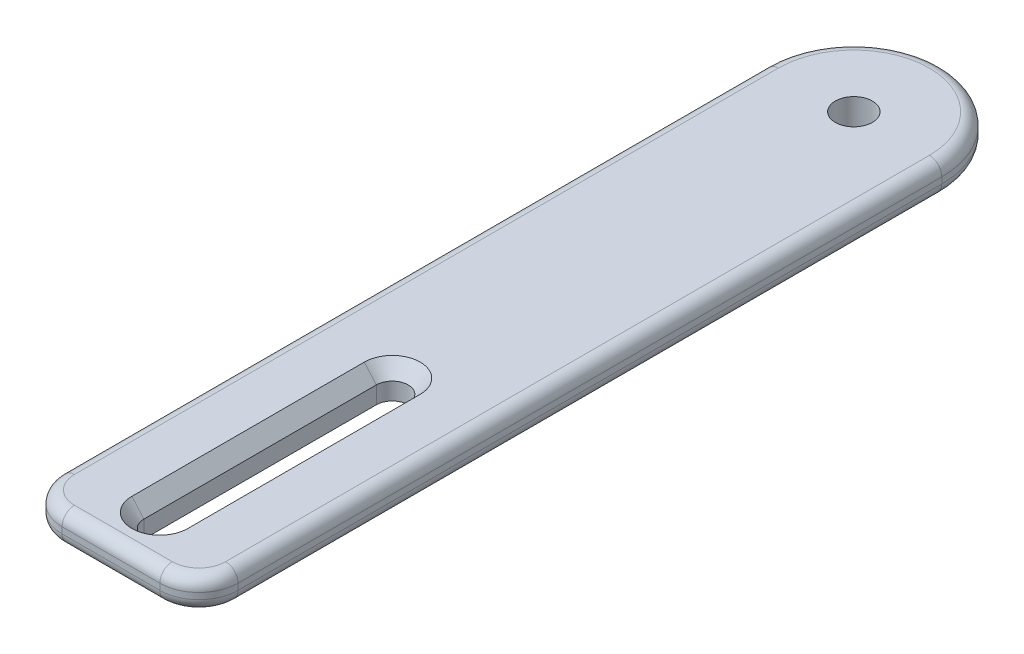
ISO-10303-21;
HEADER;
FILE_DESCRIPTION(('STEP AP214'),'2;1');
FILE_NAME('part.step','',(''),(''),'','','');
FILE_SCHEMA(('AUTOMOTIVE_DESIGN { 1 0 10303 214 1 1 1 1 }'));
ENDSEC;
DATA;
#1=APPLICATION_CONTEXT('core data for automotive mechanical design processes');
#2=APPLICATION_PROTOCOL_DEFINITION('international standard','automotive_design',2000,#1);
#3=PRODUCT_CONTEXT('',#1,'mechanical');
#4=PRODUCT('Part','Part','',(#3));
#5=PRODUCT_RELATED_PRODUCT_CATEGORY('part','',(#4));
#6=PRODUCT_DEFINITION_FORMATION('','',#4);
#7=PRODUCT_DEFINITION_CONTEXT('part definition',#1,'design');
#8=PRODUCT_DEFINITION('design','',#6,#7);
#9=PRODUCT_DEFINITION_SHAPE('','',#8);
#10=(LENGTH_UNIT() NAMED_UNIT(*) SI_UNIT(.MILLI.,.METRE.));
#11=(NAMED_UNIT(*) PLANE_ANGLE_UNIT() SI_UNIT($,.RADIAN.));
#12=(NAMED_UNIT(*) SI_UNIT($,.STERADIAN.) SOLID_ANGLE_UNIT());
#13=UNCERTAINTY_MEASURE_WITH_UNIT(LENGTH_MEASURE(1.E-05),#10,'distance_accuracy_value','');
#14=(GEOMETRIC_REPRESENTATION_CONTEXT(3) GLOBAL_UNCERTAINTY_ASSIGNED_CONTEXT((#13)) GLOBAL_UNIT_ASSIGNED_CONTEXT((#10,
#11,#12)) REPRESENTATION_CONTEXT('',''));
#15=CARTESIAN_POINT('',(0.,0.,0.));
#16=DIRECTION('',(0.,0.,1.));
#17=DIRECTION('',(1.,0.,0.));
#18=AXIS2_PLACEMENT_3D('',#15,#16,#17);
#19=CARTESIAN_POINT('',(10.63195,-3.175,0.));
#20=DIRECTION('',(-1.,0.,0.));
#21=DIRECTION('',(0.,0.,1.));
#22=AXIS2_PLACEMENT_3D('',#19,#20,#21);
#23=PLANE('',#22);
#24=DIRECTION('',(0.,1.,0.));
#25=VECTOR('',#24,1.);
#26=CARTESIAN_POINT('',(10.63195,-3.175,-5.));
#27=LINE('',#26,#25);
#28=CARTESIAN_POINT('',(10.63195,-3.175,-5.));
#29=VERTEX_POINT('',#28);
#30=CARTESIAN_POINT('',(10.63195,-1.4098340014697,-5.));
#31=VERTEX_POINT('',#30);
#32=EDGE_CURVE('E239',#29,#31,#27,.T.);
#33=ORIENTED_EDGE('',*,*,#32,.T.);
#34=DIRECTION('',(0.,0.,1.));
#35=VECTOR('',#34,1.);
#36=CARTESIAN_POINT('',(10.63195,-1.4098340014697,0.));
#37=LINE('',#36,#35);
#38=CARTESIAN_POINT('',(10.63195,-1.4098340014697,-28.78));
#39=VERTEX_POINT('',#38);
#40=EDGE_CURVE('E200',#31,#39,#37,.F.);
#41=ORIENTED_EDGE('',*,*,#40,.T.);
#42=DIRECTION('',(0.,1.,0.));
#43=VECTOR('',#42,1.);
#44=CARTESIAN_POINT('',(10.63195,-3.175,-28.78));
#45=LINE('',#44,#43);
#46=CARTESIAN_POINT('',(10.63195,-3.175,-28.78));
#47=VERTEX_POINT('',#46);
#48=EDGE_CURVE('E242',#47,#39,#45,.T.);
#49=ORIENTED_EDGE('',*,*,#48,.F.);
#50=DIRECTION('',(0.,0.,1.));
#51=VECTOR('',#50,1.);
#52=CARTESIAN_POINT('',(10.63195,-3.175,0.));
#53=LINE('',#52,#51);
#54=EDGE_CURVE('E211',#47,#29,#53,.T.);
#55=ORIENTED_EDGE('',*,*,#54,.T.);
#56=EDGE_LOOP('',(#33,#41,#49,#55));
#57=FACE_BOUND('',#56,.T.);
#58=ADVANCED_FACE('F35',(#57),#23,.T.);
#59=CARTESIAN_POINT('',(8.99999999999999,-3.175,-76.));
#60=DIRECTION('',(0.,1.,0.));
#61=DIRECTION('',(0.,0.,1.));
#62=AXIS2_PLACEMENT_3D('',#59,#60,#61);
#63=CYLINDRICAL_SURFACE('',#62,8.99999999999999);
#64=DIRECTION('',(0.,1.,0.));
#65=VECTOR('',#64,1.);
#66=CARTESIAN_POINT('',(18.,-3.175,-76.));
#67=LINE('',#66,#65);
#68=CARTESIAN_POINT('',(18.,-1.905,-76.));
#69=VERTEX_POINT('',#68);
#70=CARTESIAN_POINT('',(18.,-1.27,-76.));
#71=VERTEX_POINT('',#70);
#72=EDGE_CURVE('E217',#69,#71,#67,.T.);
#73=ORIENTED_EDGE('',*,*,#72,.F.);
#74=CARTESIAN_POINT('',(8.99999999999999,-1.905,-76.));
#75=DIRECTION('',(0.,1.,0.));
#76=DIRECTION('',(0.,0.,1.));
#77=AXIS2_PLACEMENT_3D('',#74,#75,#76);
#78=CIRCLE('',#77,8.99999999999999);
#79=CARTESIAN_POINT('',(0.,-1.905,-76.));
#80=VERTEX_POINT('',#79);
#81=EDGE_CURVE('E249',#69,#80,#78,.T.);
#82=ORIENTED_EDGE('',*,*,#81,.T.);
#83=DIRECTION('',(0.,1.,0.));
#84=VECTOR('',#83,1.);
#85=CARTESIAN_POINT('',(0.,-3.175,-76.));
#86=LINE('',#85,#84);
#87=CARTESIAN_POINT('',(0.,-1.27,-76.));
#88=VERTEX_POINT('',#87);
#89=EDGE_CURVE('E233',#80,#88,#86,.T.);
#90=ORIENTED_EDGE('',*,*,#89,.T.);
#91=CARTESIAN_POINT('',(8.99999999999999,-1.27,-76.));
#92=DIRECTION('',(0.,1.,0.));
#93=DIRECTION('',(0.,0.,1.));
#94=AXIS2_PLACEMENT_3D('',#91,#92,#93);
#95=CIRCLE('',#94,8.99999999999999);
#96=EDGE_CURVE('E220',#88,#71,#95,.F.);
#97=ORIENTED_EDGE('',*,*,#96,.T.);
#98=EDGE_LOOP('',(#73,#82,#90,#97));
#99=FACE_BOUND('',#98,.T.);
#100=ADVANCED_FACE('F385',(#99),#63,.T.);
#101=CARTESIAN_POINT('',(18.,-3.175,0.));
#102=DIRECTION('',(-1.,0.,0.));
#103=DIRECTION('',(0.,0.,1.));
#104=AXIS2_PLACEMENT_3D('',#101,#102,#103);
#105=PLANE('',#104);
#106=DIRECTION('',(0.,1.,0.));
#107=VECTOR('',#106,1.);
#108=CARTESIAN_POINT('',(18.,-3.175,-4.));
#109=LINE('',#108,#107);
#110=CARTESIAN_POINT('',(18.,-1.905,-4.));
#111=VERTEX_POINT('',#110);
#112=CARTESIAN_POINT('',(18.,-1.27,-4.));
#113=VERTEX_POINT('',#112);
#114=EDGE_CURVE('E221',#111,#113,#109,.T.);
#115=ORIENTED_EDGE('',*,*,#114,.F.);
#116=DIRECTION('',(0.,0.,1.));
#117=VECTOR('',#116,1.);
#118=CARTESIAN_POINT('',(18.,-1.905,0.));
#119=LINE('',#118,#117);
#120=EDGE_CURVE('E11',#111,#69,#119,.F.);
#121=ORIENTED_EDGE('',*,*,#120,.T.);
#122=ORIENTED_EDGE('',*,*,#72,.T.);
#123=DIRECTION('',(0.,0.,1.));
#124=VECTOR('',#123,1.);
#125=CARTESIAN_POINT('',(18.,-1.27,-4.));
#126=LINE('',#125,#124);
#127=EDGE_CURVE('E44',#71,#113,#126,.T.);
#128=ORIENTED_EDGE('',*,*,#127,.T.);
#129=EDGE_LOOP('',(#115,#121,#122,#128));
#130=FACE_BOUND('',#129,.T.);
#131=ADVANCED_FACE('F377',(#130),#105,.F.);
#132=CARTESIAN_POINT('',(14.,-3.175,-4.));
#133=DIRECTION('',(0.,1.,0.));
#134=DIRECTION('',(0.,0.,1.));
#135=AXIS2_PLACEMENT_3D('',#132,#133,#134);
#136=CYLINDRICAL_SURFACE('',#135,4.);
#137=DIRECTION('',(0.,1.,0.));
#138=VECTOR('',#137,1.);
#139=CARTESIAN_POINT('',(14.,-3.175,0.));
#140=LINE('',#139,#138);
#141=CARTESIAN_POINT('',(14.,-1.905,0.));
#142=VERTEX_POINT('',#141);
#143=CARTESIAN_POINT('',(14.,-1.27,0.));
#144=VERTEX_POINT('',#143);
#145=EDGE_CURVE('E224',#142,#144,#140,.T.);
#146=ORIENTED_EDGE('',*,*,#145,.F.);
#147=CARTESIAN_POINT('',(14.,-1.905,-4.));
#148=DIRECTION('',(0.,1.,0.));
#149=DIRECTION('',(0.,0.,1.));
#150=AXIS2_PLACEMENT_3D('',#147,#148,#149);
#151=CIRCLE('',#150,4.);
#152=EDGE_CURVE('E279',#142,#111,#151,.T.);
#153=ORIENTED_EDGE('',*,*,#152,.T.);
#154=ORIENTED_EDGE('',*,*,#114,.T.);
#155=CARTESIAN_POINT('',(14.,-1.27,-4.));
#156=DIRECTION('',(0.,1.,0.));
#157=DIRECTION('',(0.,0.,1.));
#158=AXIS2_PLACEMENT_3D('',#155,#156,#157);
#159=CIRCLE('',#158,4.);
#160=EDGE_CURVE('E277',#113,#144,#159,.F.);
#161=ORIENTED_EDGE('',*,*,#160,.T.);
#162=EDGE_LOOP('',(#146,#153,#154,#161));
#163=FACE_BOUND('',#162,.T.);
#164=ADVANCED_FACE('F374',(#163),#136,.T.);
#165=CARTESIAN_POINT('',(0.,-3.175,0.));
#166=DIRECTION('',(0.,0.,1.));
#167=DIRECTION('',(1.,0.,0.));
#168=AXIS2_PLACEMENT_3D('',#165,#166,#167);
#169=PLANE('',#168);
#170=DIRECTION('',(0.,1.,0.));
#171=VECTOR('',#170,1.);
#172=CARTESIAN_POINT('',(4.,-3.175,0.));
#173=LINE('',#172,#171);
#174=CARTESIAN_POINT('',(4.,-1.905,0.));
#175=VERTEX_POINT('',#174);
#176=CARTESIAN_POINT('',(4.,-1.27,0.));
#177=VERTEX_POINT('',#176);
#178=EDGE_CURVE('E227',#175,#177,#173,.T.);
#179=ORIENTED_EDGE('',*,*,#178,.F.);
#180=DIRECTION('',(1.,0.,0.));
#181=VECTOR('',#180,1.);
#182=CARTESIAN_POINT('',(14.,-1.905,0.));
#183=LINE('',#182,#181);
#184=EDGE_CURVE('E275',#175,#142,#183,.T.);
#185=ORIENTED_EDGE('',*,*,#184,.T.);
#186=ORIENTED_EDGE('',*,*,#145,.T.);
#187=DIRECTION('',(1.,0.,0.));
#188=VECTOR('',#187,1.);
#189=CARTESIAN_POINT('',(0.,-1.27,0.));
#190=LINE('',#189,#188);
#191=EDGE_CURVE('E273',#144,#177,#190,.F.);
#192=ORIENTED_EDGE('',*,*,#191,.T.);
#193=EDGE_LOOP('',(#179,#185,#186,#192));
#194=FACE_BOUND('',#193,.T.);
#195=ADVANCED_FACE('F335',(#194),#169,.T.);
#196=CARTESIAN_POINT('',(4.,-3.175,-4.));
#197=DIRECTION('',(0.,1.,0.));
#198=DIRECTION('',(0.,0.,1.));
#199=AXIS2_PLACEMENT_3D('',#196,#197,#198);
#200=CYLINDRICAL_SURFACE('',#199,4.);
#201=DIRECTION('',(0.,1.,0.));
#202=VECTOR('',#201,1.);
#203=CARTESIAN_POINT('',(0.,-3.175,-4.));
#204=LINE('',#203,#202);
#205=CARTESIAN_POINT('',(0.,-1.905,-4.));
#206=VERTEX_POINT('',#205);
#207=CARTESIAN_POINT('',(0.,-1.27,-4.));
#208=VERTEX_POINT('',#207);
#209=EDGE_CURVE('E230',#206,#208,#204,.T.);
#210=ORIENTED_EDGE('',*,*,#209,.F.);
#211=CARTESIAN_POINT('',(4.,-1.905,-4.));
#212=DIRECTION('',(0.,1.,0.));
#213=DIRECTION('',(0.,0.,1.));
#214=AXIS2_PLACEMENT_3D('',#211,#212,#213);
#215=CIRCLE('',#214,4.);
#216=EDGE_CURVE('E271',#206,#175,#215,.T.);
#217=ORIENTED_EDGE('',*,*,#216,.T.);
#218=ORIENTED_EDGE('',*,*,#178,.T.);
#219=CARTESIAN_POINT('',(4.,-1.27,-4.));
#220=DIRECTION('',(0.,1.,0.));
#221=DIRECTION('',(0.,0.,1.));
#222=AXIS2_PLACEMENT_3D('',#219,#220,#221);
#223=CIRCLE('',#222,4.);
#224=EDGE_CURVE('E269',#177,#208,#223,.F.);
#225=ORIENTED_EDGE('',*,*,#224,.T.);
#226=EDGE_LOOP('',(#210,#217,#218,#225));
#227=FACE_BOUND('',#226,.T.);
#228=ADVANCED_FACE('F340',(#227),#200,.T.);
#229=CARTESIAN_POINT('',(7.36805,-3.175,0.));
#230=DIRECTION('',(-1.,0.,0.));
#231=DIRECTION('',(0.,0.,1.));
#232=AXIS2_PLACEMENT_3D('',#229,#230,#231);
#233=PLANE('',#232);
#234=DIRECTION('',(0.,1.,0.));
#235=VECTOR('',#234,1.);
#236=CARTESIAN_POINT('',(7.36804999999999,-3.175,-28.78));
#237=LINE('',#236,#235);
#238=CARTESIAN_POINT('',(7.36804999999999,-3.175,-28.78));
#239=VERTEX_POINT('',#238);
#240=CARTESIAN_POINT('',(7.36804999999999,-1.4098340014697,-28.78));
#241=VERTEX_POINT('',#240);
#242=EDGE_CURVE('E216',#239,#241,#237,.T.);
#243=ORIENTED_EDGE('',*,*,#242,.T.);
#244=DIRECTION('',(0.,0.,1.));
#245=VECTOR('',#244,1.);
#246=CARTESIAN_POINT('',(7.36805,-1.4098340014697,0.));
#247=LINE('',#246,#245);
#248=CARTESIAN_POINT('',(7.36805,-1.40983400146971,-5.00000000000001));
#249=VERTEX_POINT('',#248);
#250=EDGE_CURVE('E195',#241,#249,#247,.T.);
#251=ORIENTED_EDGE('',*,*,#250,.T.);
#252=DIRECTION('',(0.,1.,0.));
#253=VECTOR('',#252,1.);
#254=CARTESIAN_POINT('',(7.36804999999999,-3.175,-5.));
#255=LINE('',#254,#253);
#256=CARTESIAN_POINT('',(7.36804999999999,-3.175,-5.));
#257=VERTEX_POINT('',#256);
#258=EDGE_CURVE('E236',#257,#249,#255,.T.);
#259=ORIENTED_EDGE('',*,*,#258,.F.);
#260=DIRECTION('',(0.,0.,1.));
#261=VECTOR('',#260,1.);
#262=CARTESIAN_POINT('',(7.36805,-3.175,0.));
#263=LINE('',#262,#261);
#264=EDGE_CURVE('E206',#239,#257,#263,.T.);
#265=ORIENTED_EDGE('',*,*,#264,.F.);
#266=EDGE_LOOP('',(#243,#251,#259,#265));
#267=FACE_BOUND('',#266,.T.);
#268=ADVANCED_FACE('F416',(#267),#233,.F.);
#269=CARTESIAN_POINT('',(8.99999999999999,-3.175,-5.));
#270=DIRECTION('',(0.,1.,0.));
#271=DIRECTION('',(0.,0.,1.));
#272=AXIS2_PLACEMENT_3D('',#269,#270,#271);
#273=CYLINDRICAL_SURFACE('',#272,1.63195);
#274=ORIENTED_EDGE('',*,*,#258,.T.);
#275=CARTESIAN_POINT('',(8.99999999999999,-1.4098340014697,-5.));
#276=DIRECTION('',(0.,1.,0.));
#277=DIRECTION('',(0.,0.,1.));
#278=AXIS2_PLACEMENT_3D('',#275,#276,#277);
#279=CIRCLE('',#278,1.63195);
#280=EDGE_CURVE('E171',#249,#31,#279,.T.);
#281=ORIENTED_EDGE('',*,*,#280,.T.);
#282=ORIENTED_EDGE('',*,*,#32,.F.);
#283=CARTESIAN_POINT('',(8.99999999999999,-3.175,-5.));
#284=DIRECTION('',(0.,1.,0.));
#285=DIRECTION('',(0.,0.,1.));
#286=AXIS2_PLACEMENT_3D('',#283,#284,#285);
#287=CIRCLE('',#286,1.63195);
#288=EDGE_CURVE('E214',#257,#29,#287,.T.);
#289=ORIENTED_EDGE('',*,*,#288,.F.);
#290=EDGE_LOOP('',(#274,#281,#282,#289));
#291=FACE_BOUND('',#290,.T.);
#292=ADVANCED_FACE('F410',(#291),#273,.F.);
#293=CARTESIAN_POINT('',(8.99999999999999,-3.175,-28.78));
#294=DIRECTION('',(0.,1.,0.));
#295=DIRECTION('',(0.,0.,1.));
#296=AXIS2_PLACEMENT_3D('',#293,#294,#295);
#297=CYLINDRICAL_SURFACE('',#296,1.63195000000001);
#298=ORIENTED_EDGE('',*,*,#48,.T.);
#299=CARTESIAN_POINT('',(8.99999999999999,-1.4098340014697,-28.78));
#300=DIRECTION('',(0.,1.,0.));
#301=DIRECTION('',(0.,0.,1.));
#302=AXIS2_PLACEMENT_3D('',#299,#300,#301);
#303=CIRCLE('',#302,1.63195000000001);
#304=EDGE_CURVE('E203',#39,#241,#303,.T.);
#305=ORIENTED_EDGE('',*,*,#304,.T.);
#306=ORIENTED_EDGE('',*,*,#242,.F.);
#307=CARTESIAN_POINT('',(8.99999999999999,-3.175,-28.78));
#308=DIRECTION('',(0.,1.,0.));
#309=DIRECTION('',(0.,0.,1.));
#310=AXIS2_PLACEMENT_3D('',#307,#308,#309);
#311=CIRCLE('',#310,1.63195000000001);
#312=EDGE_CURVE('E209',#47,#239,#311,.T.);
#313=ORIENTED_EDGE('',*,*,#312,.F.);
#314=EDGE_LOOP('',(#298,#305,#306,#313));
#315=FACE_BOUND('',#314,.T.);
#316=ADVANCED_FACE('F411',(#315),#297,.F.);
#317=CARTESIAN_POINT('',(0.,-3.175,0.));
#318=DIRECTION('',(-1.,0.,0.));
#319=DIRECTION('',(0.,0.,1.));
#320=AXIS2_PLACEMENT_3D('',#317,#318,#319);
#321=PLANE('',#320);
#322=ORIENTED_EDGE('',*,*,#89,.F.);
#323=DIRECTION('',(0.,0.,1.));
#324=VECTOR('',#323,1.);
#325=CARTESIAN_POINT('',(0.,-1.905,-4.));
#326=LINE('',#325,#324);
#327=EDGE_CURVE('E267',#80,#206,#326,.T.);
#328=ORIENTED_EDGE('',*,*,#327,.T.);
#329=ORIENTED_EDGE('',*,*,#209,.T.);
#330=DIRECTION('',(0.,0.,1.));
#331=VECTOR('',#330,1.);
#332=CARTESIAN_POINT('',(0.,-1.27,0.));
#333=LINE('',#332,#331);
#334=EDGE_CURVE('E265',#208,#88,#333,.F.);
#335=ORIENTED_EDGE('',*,*,#334,.T.);
#336=EDGE_LOOP('',(#322,#328,#329,#335));
#337=FACE_BOUND('',#336,.T.);
#338=ADVANCED_FACE('F414',(#337),#321,.T.);
#339=CARTESIAN_POINT('',(0.,-3.175,0.));
#340=DIRECTION('',(0.,1.,0.));
#341=DIRECTION('',(0.,0.,1.));
#342=AXIS2_PLACEMENT_3D('',#339,#340,#341);
#343=PLANE('',#342);
#344=DIRECTION('',(0.,0.,1.));
#345=VECTOR('',#344,1.);
#346=CARTESIAN_POINT('',(1.27,-3.175,-76.));
#347=LINE('',#346,#345);
#348=CARTESIAN_POINT('',(1.27,-3.175,-4.));
#349=VERTEX_POINT('',#348);
#350=CARTESIAN_POINT('',(1.27,-3.175,-76.));
#351=VERTEX_POINT('',#350);
#352=EDGE_CURVE('E260',#349,#351,#347,.F.);
#353=ORIENTED_EDGE('',*,*,#352,.T.);
#354=CARTESIAN_POINT('',(8.99999999999999,-3.175,-76.));
#355=DIRECTION('',(0.,1.,0.));
#356=DIRECTION('',(0.,0.,1.));
#357=AXIS2_PLACEMENT_3D('',#354,#355,#356);
#358=CIRCLE('',#357,7.72999999999999);
#359=CARTESIAN_POINT('',(16.73,-3.175,-76.));
#360=VERTEX_POINT('',#359);
#361=EDGE_CURVE('E262',#351,#360,#358,.F.);
#362=ORIENTED_EDGE('',*,*,#361,.T.);
#363=DIRECTION('',(0.,0.,1.));
#364=VECTOR('',#363,1.);
#365=CARTESIAN_POINT('',(16.73,-3.175,0.));
#366=LINE('',#365,#364);
#367=CARTESIAN_POINT('',(16.73,-3.175,-4.));
#368=VERTEX_POINT('',#367);
#369=EDGE_CURVE('E252',#360,#368,#366,.T.);
#370=ORIENTED_EDGE('',*,*,#369,.T.);
#371=CARTESIAN_POINT('',(14.,-3.175,-4.));
#372=DIRECTION('',(0.,1.,0.));
#373=DIRECTION('',(0.,0.,1.));
#374=AXIS2_PLACEMENT_3D('',#371,#372,#373);
#375=CIRCLE('',#374,2.73);
#376=CARTESIAN_POINT('',(14.,-3.175,-1.27));
#377=VERTEX_POINT('',#376);
#378=EDGE_CURVE('E254',#368,#377,#375,.F.);
#379=ORIENTED_EDGE('',*,*,#378,.T.);
#380=DIRECTION('',(1.,0.,0.));
#381=VECTOR('',#380,1.);
#382=CARTESIAN_POINT('',(4.,-3.175,-1.27));
#383=LINE('',#382,#381);
#384=CARTESIAN_POINT('',(4.,-3.175,-1.27));
#385=VERTEX_POINT('',#384);
#386=EDGE_CURVE('E256',#377,#385,#383,.F.);
#387=ORIENTED_EDGE('',*,*,#386,.T.);
#388=CARTESIAN_POINT('',(4.,-3.175,-4.));
#389=DIRECTION('',(0.,1.,0.));
#390=DIRECTION('',(0.,0.,1.));
#391=AXIS2_PLACEMENT_3D('',#388,#389,#390);
#392=CIRCLE('',#391,2.73);
#393=EDGE_CURVE('E258',#385,#349,#392,.F.);
#394=ORIENTED_EDGE('',*,*,#393,.T.);
#395=EDGE_LOOP('',(#353,#362,#370,#379,#387,#394));
#396=FACE_BOUND('',#395,.T.);
#397=CARTESIAN_POINT('',(8.99999999999999,-3.175,-76.));
#398=DIRECTION('',(0.,1.,0.));
#399=DIRECTION('',(0.,0.,1.));
#400=AXIS2_PLACEMENT_3D('',#397,#398,#399);
#401=CIRCLE('',#400,1.89865);
#402=CARTESIAN_POINT('',(8.99999999999999,-3.175,-74.10135));
#403=VERTEX_POINT('',#402);
#404=EDGE_CURVE('E641',#403,#403,#401,.T.);
#405=ORIENTED_EDGE('',*,*,#404,.T.);
#406=EDGE_LOOP('',(#405));
#407=FACE_BOUND('',#406,.T.);
#408=ORIENTED_EDGE('',*,*,#264,.T.);
#409=ORIENTED_EDGE('',*,*,#288,.T.);
#410=ORIENTED_EDGE('',*,*,#54,.F.);
#411=ORIENTED_EDGE('',*,*,#312,.T.);
#412=EDGE_LOOP('',(#408,#409,#410,#411));
#413=FACE_BOUND('',#412,.T.);
#414=ADVANCED_FACE('F354',(#396,#407,#413),#343,.F.);
#415=CARTESIAN_POINT('',(0.,0.,0.));
#416=DIRECTION('',(0.,1.,0.));
#417=DIRECTION('',(0.,0.,1.));
#418=AXIS2_PLACEMENT_3D('',#415,#416,#417);
#419=PLANE('',#418);
#420=DIRECTION('',(0.,0.,1.));
#421=VECTOR('',#420,1.);
#422=CARTESIAN_POINT('',(16.73,0.,-76.));
#423=LINE('',#422,#421);
#424=CARTESIAN_POINT('',(16.73,0.,-4.));
#425=VERTEX_POINT('',#424);
#426=CARTESIAN_POINT('',(16.73,0.,-76.));
#427=VERTEX_POINT('',#426);
#428=EDGE_CURVE('E281',#425,#427,#423,.F.);
#429=ORIENTED_EDGE('',*,*,#428,.T.);
#430=CARTESIAN_POINT('',(8.99999999999999,0.,-76.));
#431=DIRECTION('',(0.,1.,0.));
#432=DIRECTION('',(0.,0.,1.));
#433=AXIS2_PLACEMENT_3D('',#430,#431,#432);
#434=CIRCLE('',#433,7.72999999999999);
#435=CARTESIAN_POINT('',(1.27,0.,-76.));
#436=VERTEX_POINT('',#435);
#437=EDGE_CURVE('E290',#427,#436,#434,.T.);
#438=ORIENTED_EDGE('',*,*,#437,.T.);
#439=DIRECTION('',(0.,0.,1.));
#440=VECTOR('',#439,1.);
#441=CARTESIAN_POINT('',(1.27000000000001,0.,0.));
#442=LINE('',#441,#440);
#443=CARTESIAN_POINT('',(1.27,0.,-4.));
#444=VERTEX_POINT('',#443);
#445=EDGE_CURVE('E59',#436,#444,#442,.T.);
#446=ORIENTED_EDGE('',*,*,#445,.T.);
#447=CARTESIAN_POINT('',(4.,0.,-4.));
#448=DIRECTION('',(0.,1.,0.));
#449=DIRECTION('',(0.,0.,1.));
#450=AXIS2_PLACEMENT_3D('',#447,#448,#449);
#451=CIRCLE('',#450,2.73);
#452=CARTESIAN_POINT('',(4.,0.,-1.27));
#453=VERTEX_POINT('',#452);
#454=EDGE_CURVE('E287',#444,#453,#451,.T.);
#455=ORIENTED_EDGE('',*,*,#454,.T.);
#456=DIRECTION('',(1.,0.,0.));
#457=VECTOR('',#456,1.);
#458=CARTESIAN_POINT('',(0.,0.,-1.27));
#459=LINE('',#458,#457);
#460=CARTESIAN_POINT('',(14.,0.,-1.27));
#461=VERTEX_POINT('',#460);
#462=EDGE_CURVE('E285',#453,#461,#459,.T.);
#463=ORIENTED_EDGE('',*,*,#462,.T.);
#464=CARTESIAN_POINT('',(14.,0.,-4.));
#465=DIRECTION('',(0.,1.,0.));
#466=DIRECTION('',(0.,0.,1.));
#467=AXIS2_PLACEMENT_3D('',#464,#465,#466);
#468=CIRCLE('',#467,2.73);
#469=EDGE_CURVE('E283',#461,#425,#468,.T.);
#470=ORIENTED_EDGE('',*,*,#469,.T.);
#471=EDGE_LOOP('',(#429,#438,#446,#455,#463,#470));
#472=FACE_BOUND('',#471,.T.);
#473=CARTESIAN_POINT('',(8.99999999999999,0.,-76.));
#474=DIRECTION('',(0.,1.,0.));
#475=DIRECTION('',(0.,0.,1.));
#476=AXIS2_PLACEMENT_3D('',#473,#474,#475);
#477=CIRCLE('',#476,1.89864999999999);
#478=CARTESIAN_POINT('',(8.99999999999999,0.,-74.10135));
#479=VERTEX_POINT('',#478);
#480=EDGE_CURVE('E309',#479,#479,#477,.T.);
#481=ORIENTED_EDGE('',*,*,#480,.F.);
#482=EDGE_LOOP('',(#481));
#483=FACE_BOUND('',#482,.T.);
#484=CARTESIAN_POINT('',(8.99999999999999,0.,-28.78));
#485=DIRECTION('',(0.,1.,0.));
#486=DIRECTION('',(0.,0.,1.));
#487=AXIS2_PLACEMENT_3D('',#484,#485,#486);
#488=CIRCLE('',#487,2.85750000000001);
#489=CARTESIAN_POINT('',(11.8575,0.,-28.78));
#490=VERTEX_POINT('',#489);
#491=CARTESIAN_POINT('',(6.14249999999999,0.,-28.78));
#492=VERTEX_POINT('',#491);
#493=EDGE_CURVE('E184',#490,#492,#488,.T.);
#494=ORIENTED_EDGE('',*,*,#493,.F.);
#495=DIRECTION('',(0.,0.,1.));
#496=VECTOR('',#495,1.);
#497=CARTESIAN_POINT('',(11.8575,0.,-28.78));
#498=LINE('',#497,#496);
#499=CARTESIAN_POINT('',(11.8575,0.,-5.));
#500=VERTEX_POINT('',#499);
#501=EDGE_CURVE('E188',#490,#500,#498,.T.);
#502=ORIENTED_EDGE('',*,*,#501,.T.);
#503=CARTESIAN_POINT('',(8.99999999999999,0.,-5.));
#504=DIRECTION('',(0.,1.,0.));
#505=DIRECTION('',(0.,0.,1.));
#506=AXIS2_PLACEMENT_3D('',#503,#504,#505);
#507=CIRCLE('',#506,2.8575);
#508=CARTESIAN_POINT('',(6.14249999999999,0.,-5.00000000000001));
#509=VERTEX_POINT('',#508);
#510=EDGE_CURVE('E168',#509,#500,#507,.T.);
#511=ORIENTED_EDGE('',*,*,#510,.F.);
#512=DIRECTION('',(0.,0.,1.));
#513=VECTOR('',#512,1.);
#514=CARTESIAN_POINT('',(6.14249999999998,0.,-28.78));
#515=LINE('',#514,#513);
#516=EDGE_CURVE('E180',#492,#509,#515,.T.);
#517=ORIENTED_EDGE('',*,*,#516,.F.);
#518=EDGE_LOOP('',(#494,#502,#511,#517));
#519=FACE_BOUND('',#518,.T.);
#520=ADVANCED_FACE('F186',(#472,#483,#519),#419,.T.);
#521=CARTESIAN_POINT('',(8.99999999999999,0.,-28.78));
#522=DIRECTION('',(0.,1.,0.));
#523=DIRECTION('',(0.,0.,1.));
#524=AXIS2_PLACEMENT_3D('',#521,#522,#523);
#525=CONICAL_SURFACE('',#524,2.85750000000001,0.715584993317677);
#526=DIRECTION('',(0.656059028990508,0.754709580222771,0.));
#527=VECTOR('',#526,1.);
#528=CARTESIAN_POINT('',(11.8575,0.,-28.78));
#529=LINE('',#528,#527);
#530=EDGE_CURVE('E193',#39,#490,#529,.T.);
#531=ORIENTED_EDGE('',*,*,#530,.T.);
#532=ORIENTED_EDGE('',*,*,#493,.T.);
#533=DIRECTION('',(-0.656059028990508,0.754709580222771,0.));
#534=VECTOR('',#533,1.);
#535=CARTESIAN_POINT('',(6.14249999999998,0.,-28.78));
#536=LINE('',#535,#534);
#537=EDGE_CURVE('E176',#241,#492,#536,.T.);
#538=ORIENTED_EDGE('',*,*,#537,.F.);
#539=ORIENTED_EDGE('',*,*,#304,.F.);
#540=EDGE_LOOP('',(#531,#532,#538,#539));
#541=FACE_BOUND('',#540,.T.);
#542=ADVANCED_FACE('F531',(#541),#525,.F.);
#543=CARTESIAN_POINT('',(8.99999999999999,0.,-5.));
#544=DIRECTION('',(0.,1.,0.));
#545=DIRECTION('',(0.,0.,1.));
#546=AXIS2_PLACEMENT_3D('',#543,#544,#545);
#547=CONICAL_SURFACE('',#546,2.8575,0.715584993317677);
#548=DIRECTION('',(-0.656059028990508,0.754709580222771,0.));
#549=VECTOR('',#548,1.);
#550=CARTESIAN_POINT('',(6.14249999999999,0.,-5.));
#551=LINE('',#550,#549);
#552=EDGE_CURVE('E163',#249,#509,#551,.T.);
#553=ORIENTED_EDGE('',*,*,#552,.T.);
#554=ORIENTED_EDGE('',*,*,#510,.T.);
#555=DIRECTION('',(0.656059028990508,0.754709580222771,0.));
#556=VECTOR('',#555,1.);
#557=CARTESIAN_POINT('',(11.8575,0.,-5.));
#558=LINE('',#557,#556);
#559=EDGE_CURVE('E175',#31,#500,#558,.T.);
#560=ORIENTED_EDGE('',*,*,#559,.F.);
#561=ORIENTED_EDGE('',*,*,#280,.F.);
#562=EDGE_LOOP('',(#553,#554,#560,#561));
#563=FACE_BOUND('',#562,.T.);
#564=ADVANCED_FACE('F165',(#563),#547,.F.);
#565=CARTESIAN_POINT('',(6.14249999999998,0.,-28.78));
#566=DIRECTION('',(-0.754709580222771,-0.656059028990508,0.));
#567=DIRECTION('',(0.656059028990508,-0.754709580222771,0.));
#568=AXIS2_PLACEMENT_3D('',#565,#566,#567);
#569=PLANE('',#568);
#570=ORIENTED_EDGE('',*,*,#537,.T.);
#571=ORIENTED_EDGE('',*,*,#516,.T.);
#572=ORIENTED_EDGE('',*,*,#552,.F.);
#573=ORIENTED_EDGE('',*,*,#250,.F.);
#574=EDGE_LOOP('',(#570,#571,#572,#573));
#575=FACE_BOUND('',#574,.T.);
#576=ADVANCED_FACE('F181',(#575),#569,.F.);
#577=CARTESIAN_POINT('',(11.8575,0.,-28.78));
#578=DIRECTION('',(0.754709580222771,-0.656059028990508,0.));
#579=DIRECTION('',(0.656059028990508,0.754709580222771,0.));
#580=AXIS2_PLACEMENT_3D('',#577,#578,#579);
#581=PLANE('',#580);
#582=ORIENTED_EDGE('',*,*,#559,.T.);
#583=ORIENTED_EDGE('',*,*,#501,.F.);
#584=ORIENTED_EDGE('',*,*,#530,.F.);
#585=ORIENTED_EDGE('',*,*,#40,.F.);
#586=EDGE_LOOP('',(#582,#583,#584,#585));
#587=FACE_BOUND('',#586,.T.);
#588=ADVANCED_FACE('F506',(#587),#581,.F.);
#589=CARTESIAN_POINT('',(8.99999999999999,0.,-76.));
#590=DIRECTION('',(0.,1.,0.));
#591=DIRECTION('',(0.,0.,1.));
#592=AXIS2_PLACEMENT_3D('',#589,#590,#591);
#593=CYLINDRICAL_SURFACE('',#592,1.89864999999999);
#594=ORIENTED_EDGE('',*,*,#404,.F.);
#595=EDGE_LOOP('',(#594));
#596=FACE_BOUND('',#595,.T.);
#597=ORIENTED_EDGE('',*,*,#480,.T.);
#598=EDGE_LOOP('',(#597));
#599=FACE_BOUND('',#598,.T.);
#600=ADVANCED_FACE('F432',(#596,#599),#593,.F.);
#601=CARTESIAN_POINT('',(0.,-1.905,-1.27));
#602=DIRECTION('',(-1.,0.,0.));
#603=DIRECTION('',(0.,0.,1.));
#604=AXIS2_PLACEMENT_3D('',#601,#602,#603);
#605=CYLINDRICAL_SURFACE('',#604,1.27);
#606=CARTESIAN_POINT('',(4.,-1.905,-1.27));
#607=DIRECTION('',(-1.,0.,0.));
#608=DIRECTION('',(0.,0.,1.));
#609=AXIS2_PLACEMENT_3D('',#606,#607,#608);
#610=CIRCLE('',#609,1.27);
#611=EDGE_CURVE('E303',#385,#175,#610,.T.);
#612=ORIENTED_EDGE('',*,*,#611,.F.);
#613=ORIENTED_EDGE('',*,*,#386,.F.);
#614=CARTESIAN_POINT('',(14.,-1.905,-1.27));
#615=DIRECTION('',(1.,0.,0.));
#616=DIRECTION('',(0.,0.,-1.));
#617=AXIS2_PLACEMENT_3D('',#614,#615,#616);
#618=CIRCLE('',#617,1.27);
#619=EDGE_CURVE('E306',#142,#377,#618,.T.);
#620=ORIENTED_EDGE('',*,*,#619,.F.);
#621=ORIENTED_EDGE('',*,*,#184,.F.);
#622=EDGE_LOOP('',(#612,#613,#620,#621));
#623=FACE_BOUND('',#622,.T.);
#624=ADVANCED_FACE('F372',(#623),#605,.T.);
#625=CARTESIAN_POINT('',(14.,-1.905,-4.));
#626=DIRECTION('',(0.,1.,0.));
#627=DIRECTION('',(0.,0.,1.));
#628=AXIS2_PLACEMENT_3D('',#625,#626,#627);
#629=TOROIDAL_SURFACE('',#628,2.73,1.27);
#630=ORIENTED_EDGE('',*,*,#619,.T.);
#631=ORIENTED_EDGE('',*,*,#378,.F.);
#632=CARTESIAN_POINT('',(16.73,-1.905,-4.));
#633=DIRECTION('',(0.,0.,-1.));
#634=DIRECTION('',(-1.,0.,0.));
#635=AXIS2_PLACEMENT_3D('',#632,#633,#634);
#636=CIRCLE('',#635,1.27);
#637=EDGE_CURVE('E300',#111,#368,#636,.T.);
#638=ORIENTED_EDGE('',*,*,#637,.F.);
#639=ORIENTED_EDGE('',*,*,#152,.F.);
#640=EDGE_LOOP('',(#630,#631,#638,#639));
#641=FACE_BOUND('',#640,.T.);
#642=ADVANCED_FACE('F368',(#641),#629,.T.);
#643=CARTESIAN_POINT('',(4.,-1.905,-4.));
#644=DIRECTION('',(0.,1.,0.));
#645=DIRECTION('',(0.,0.,1.));
#646=AXIS2_PLACEMENT_3D('',#643,#644,#645);
#647=TOROIDAL_SURFACE('',#646,2.73,1.27);
#648=ORIENTED_EDGE('',*,*,#611,.T.);
#649=ORIENTED_EDGE('',*,*,#216,.F.);
#650=CARTESIAN_POINT('',(1.27,-1.905,-4.));
#651=DIRECTION('',(0.,0.,-1.));
#652=DIRECTION('',(-1.,0.,0.));
#653=AXIS2_PLACEMENT_3D('',#650,#651,#652);
#654=CIRCLE('',#653,1.27);
#655=EDGE_CURVE('E297',#349,#206,#654,.T.);
#656=ORIENTED_EDGE('',*,*,#655,.F.);
#657=ORIENTED_EDGE('',*,*,#393,.F.);
#658=EDGE_LOOP('',(#648,#649,#656,#657));
#659=FACE_BOUND('',#658,.T.);
#660=ADVANCED_FACE('F344',(#659),#647,.T.);
#661=CARTESIAN_POINT('',(16.73,-1.905,0.));
#662=DIRECTION('',(0.,0.,1.));
#663=DIRECTION('',(1.,0.,0.));
#664=AXIS2_PLACEMENT_3D('',#661,#662,#663);
#665=CYLINDRICAL_SURFACE('',#664,1.27);
#666=ORIENTED_EDGE('',*,*,#637,.T.);
#667=ORIENTED_EDGE('',*,*,#369,.F.);
#668=CARTESIAN_POINT('',(16.73,-1.905,-76.));
#669=DIRECTION('',(0.,0.,-1.));
#670=DIRECTION('',(-1.,0.,0.));
#671=AXIS2_PLACEMENT_3D('',#668,#669,#670);
#672=CIRCLE('',#671,1.27);
#673=EDGE_CURVE('E295',#69,#360,#672,.T.);
#674=ORIENTED_EDGE('',*,*,#673,.F.);
#675=ORIENTED_EDGE('',*,*,#120,.F.);
#676=EDGE_LOOP('',(#666,#667,#674,#675));
#677=FACE_BOUND('',#676,.T.);
#678=ADVANCED_FACE('F363',(#677),#665,.T.);
#679=CARTESIAN_POINT('',(1.27000000000001,-1.905,0.));
#680=DIRECTION('',(0.,0.,-1.));
#681=DIRECTION('',(-1.,0.,0.));
#682=AXIS2_PLACEMENT_3D('',#679,#680,#681);
#683=CYLINDRICAL_SURFACE('',#682,1.27);
#684=ORIENTED_EDGE('',*,*,#655,.T.);
#685=ORIENTED_EDGE('',*,*,#327,.F.);
#686=CARTESIAN_POINT('',(1.27,-1.905,-76.));
#687=DIRECTION('',(0.,0.,-1.));
#688=DIRECTION('',(-1.,0.,0.));
#689=AXIS2_PLACEMENT_3D('',#686,#687,#688);
#690=CIRCLE('',#689,1.27);
#691=EDGE_CURVE('E293',#351,#80,#690,.T.);
#692=ORIENTED_EDGE('',*,*,#691,.F.);
#693=ORIENTED_EDGE('',*,*,#352,.F.);
#694=EDGE_LOOP('',(#684,#685,#692,#693));
#695=FACE_BOUND('',#694,.T.);
#696=ADVANCED_FACE('F350',(#695),#683,.T.);
#697=CARTESIAN_POINT('',(8.99999999999999,-1.905,-76.));
#698=DIRECTION('',(0.,1.,0.));
#699=DIRECTION('',(0.,0.,1.));
#700=AXIS2_PLACEMENT_3D('',#697,#698,#699);
#701=TOROIDAL_SURFACE('',#700,7.72999999999999,1.27);
#702=ORIENTED_EDGE('',*,*,#673,.T.);
#703=ORIENTED_EDGE('',*,*,#361,.F.);
#704=ORIENTED_EDGE('',*,*,#691,.T.);
#705=ORIENTED_EDGE('',*,*,#81,.F.);
#706=EDGE_LOOP('',(#702,#703,#704,#705));
#707=FACE_BOUND('',#706,.T.);
#708=ADVANCED_FACE('F357',(#707),#701,.T.);
#709=CARTESIAN_POINT('',(0.,-1.27,-1.27));
#710=DIRECTION('',(1.,0.,0.));
#711=DIRECTION('',(0.,0.,-1.));
#712=AXIS2_PLACEMENT_3D('',#709,#710,#711);
#713=CYLINDRICAL_SURFACE('',#712,1.27);
#714=CARTESIAN_POINT('',(4.,-1.27,-1.27));
#715=DIRECTION('',(-1.,0.,0.));
#716=DIRECTION('',(0.,0.,1.));
#717=AXIS2_PLACEMENT_3D('',#714,#715,#716);
#718=CIRCLE('',#717,1.27);
#719=EDGE_CURVE('E318',#177,#453,#718,.T.);
#720=ORIENTED_EDGE('',*,*,#719,.F.);
#721=ORIENTED_EDGE('',*,*,#191,.F.);
#722=CARTESIAN_POINT('',(14.,-1.27,-1.27));
#723=DIRECTION('',(1.,0.,0.));
#724=DIRECTION('',(0.,0.,-1.));
#725=AXIS2_PLACEMENT_3D('',#722,#723,#724);
#726=CIRCLE('',#725,1.27);
#727=EDGE_CURVE('E39',#461,#144,#726,.T.);
#728=ORIENTED_EDGE('',*,*,#727,.F.);
#729=ORIENTED_EDGE('',*,*,#462,.F.);
#730=EDGE_LOOP('',(#720,#721,#728,#729));
#731=FACE_BOUND('',#730,.T.);
#732=ADVANCED_FACE('F37',(#731),#713,.T.);
#733=CARTESIAN_POINT('',(14.,-1.27,-4.));
#734=DIRECTION('',(0.,1.,0.));
#735=DIRECTION('',(0.,0.,1.));
#736=AXIS2_PLACEMENT_3D('',#733,#734,#735);
#737=TOROIDAL_SURFACE('',#736,2.73,1.27);
#738=ORIENTED_EDGE('',*,*,#727,.T.);
#739=ORIENTED_EDGE('',*,*,#160,.F.);
#740=CARTESIAN_POINT('',(16.73,-1.27,-4.));
#741=DIRECTION('',(0.,0.,-1.));
#742=DIRECTION('',(-1.,0.,0.));
#743=AXIS2_PLACEMENT_3D('',#740,#741,#742);
#744=CIRCLE('',#743,1.27);
#745=EDGE_CURVE('E316',#425,#113,#744,.T.);
#746=ORIENTED_EDGE('',*,*,#745,.F.);
#747=ORIENTED_EDGE('',*,*,#469,.F.);
#748=EDGE_LOOP('',(#738,#739,#746,#747));
#749=FACE_BOUND('',#748,.T.);
#750=ADVANCED_FACE('F328',(#749),#737,.T.);
#751=CARTESIAN_POINT('',(4.,-1.27,-4.));
#752=DIRECTION('',(0.,1.,0.));
#753=DIRECTION('',(0.,0.,1.));
#754=AXIS2_PLACEMENT_3D('',#751,#752,#753);
#755=TOROIDAL_SURFACE('',#754,2.73,1.27);
#756=ORIENTED_EDGE('',*,*,#719,.T.);
#757=ORIENTED_EDGE('',*,*,#454,.F.);
#758=CARTESIAN_POINT('',(1.27,-1.27,-4.));
#759=DIRECTION('',(0.,0.,-1.));
#760=DIRECTION('',(-1.,0.,0.));
#761=AXIS2_PLACEMENT_3D('',#758,#759,#760);
#762=CIRCLE('',#761,1.27);
#763=EDGE_CURVE('E313',#208,#444,#762,.T.);
#764=ORIENTED_EDGE('',*,*,#763,.F.);
#765=ORIENTED_EDGE('',*,*,#224,.F.);
#766=EDGE_LOOP('',(#756,#757,#764,#765));
#767=FACE_BOUND('',#766,.T.);
#768=ADVANCED_FACE('F393',(#767),#755,.T.);
#769=CARTESIAN_POINT('',(16.73,-1.27,0.));
#770=DIRECTION('',(0.,0.,-1.));
#771=DIRECTION('',(-1.,0.,0.));
#772=AXIS2_PLACEMENT_3D('',#769,#770,#771);
#773=CYLINDRICAL_SURFACE('',#772,1.27);
#774=ORIENTED_EDGE('',*,*,#745,.T.);
#775=ORIENTED_EDGE('',*,*,#127,.F.);
#776=CARTESIAN_POINT('',(16.73,-1.27,-76.));
#777=DIRECTION('',(0.,0.,-1.));
#778=DIRECTION('',(-1.,0.,0.));
#779=AXIS2_PLACEMENT_3D('',#776,#777,#778);
#780=CIRCLE('',#779,1.27);
#781=EDGE_CURVE('E311',#427,#71,#780,.T.);
#782=ORIENTED_EDGE('',*,*,#781,.F.);
#783=ORIENTED_EDGE('',*,*,#428,.F.);
#784=EDGE_LOOP('',(#774,#775,#782,#783));
#785=FACE_BOUND('',#784,.T.);
#786=ADVANCED_FACE('F382',(#785),#773,.T.);
#787=CARTESIAN_POINT('',(1.27000000000001,-1.27,0.));
#788=DIRECTION('',(0.,0.,1.));
#789=DIRECTION('',(1.,0.,0.));
#790=AXIS2_PLACEMENT_3D('',#787,#788,#789);
#791=CYLINDRICAL_SURFACE('',#790,1.27);
#792=ORIENTED_EDGE('',*,*,#763,.T.);
#793=ORIENTED_EDGE('',*,*,#445,.F.);
#794=CARTESIAN_POINT('',(1.27,-1.27,-76.));
#795=DIRECTION('',(0.,0.,-1.));
#796=DIRECTION('',(-1.,0.,0.));
#797=AXIS2_PLACEMENT_3D('',#794,#795,#796);
#798=CIRCLE('',#797,1.27);
#799=EDGE_CURVE('E52',#88,#436,#798,.T.);
#800=ORIENTED_EDGE('',*,*,#799,.F.);
#801=ORIENTED_EDGE('',*,*,#334,.F.);
#802=EDGE_LOOP('',(#792,#793,#800,#801));
#803=FACE_BOUND('',#802,.T.);
#804=ADVANCED_FACE('F390',(#803),#791,.T.);
#805=CARTESIAN_POINT('',(8.99999999999999,-1.27,-76.));
#806=DIRECTION('',(0.,1.,0.));
#807=DIRECTION('',(0.,0.,1.));
#808=AXIS2_PLACEMENT_3D('',#805,#806,#807);
#809=TOROIDAL_SURFACE('',#808,7.72999999999999,1.27);
#810=ORIENTED_EDGE('',*,*,#781,.T.);
#811=ORIENTED_EDGE('',*,*,#96,.F.);
#812=ORIENTED_EDGE('',*,*,#799,.T.);
#813=ORIENTED_EDGE('',*,*,#437,.F.);
#814=EDGE_LOOP('',(#810,#811,#812,#813));
#815=FACE_BOUND('',#814,.T.);
#816=ADVANCED_FACE('F387',(#815),#809,.T.);
#817=CLOSED_SHELL('',(#58,#100,#131,#164,#195,#228,#268,#292,#316,#338,#414,#520,#542,#564,#576,
#588,#600,#624,#642,#660,#678,#696,#708,#732,#750,#768,#786,#804,#816));
#818=MANIFOLD_SOLID_BREP('B2',#817);
#819=ADVANCED_BREP_SHAPE_REPRESENTATION('',(#18,#818),#14);
#820=SHAPE_DEFINITION_REPRESENTATION(#9,#819);
ENDSEC;
END-ISO-10303-21;
